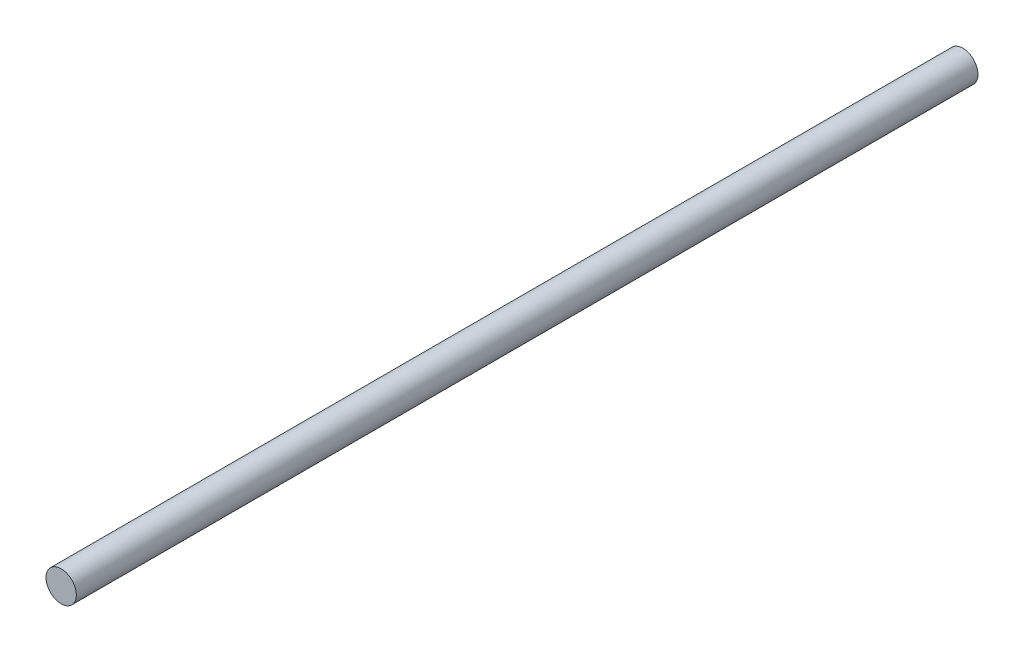
ISO-10303-21;
HEADER;
FILE_DESCRIPTION(('STEP AP214'),'2;1');
FILE_NAME('part.step','',(''),(''),'','','');
FILE_SCHEMA(('AUTOMOTIVE_DESIGN { 1 0 10303 214 1 1 1 1 }'));
ENDSEC;
DATA;
#1=APPLICATION_CONTEXT('core data for automotive mechanical design processes');
#2=APPLICATION_PROTOCOL_DEFINITION('international standard','automotive_design',2000,#1);
#3=PRODUCT_CONTEXT('',#1,'mechanical');
#4=PRODUCT('Part','Part','',(#3));
#5=PRODUCT_RELATED_PRODUCT_CATEGORY('part','',(#4));
#6=PRODUCT_DEFINITION_FORMATION('','',#4);
#7=PRODUCT_DEFINITION_CONTEXT('part definition',#1,'design');
#8=PRODUCT_DEFINITION('design','',#6,#7);
#9=PRODUCT_DEFINITION_SHAPE('','',#8);
#10=(LENGTH_UNIT() NAMED_UNIT(*) SI_UNIT(.MILLI.,.METRE.));
#11=(NAMED_UNIT(*) PLANE_ANGLE_UNIT() SI_UNIT($,.RADIAN.));
#12=(NAMED_UNIT(*) SI_UNIT($,.STERADIAN.) SOLID_ANGLE_UNIT());
#13=UNCERTAINTY_MEASURE_WITH_UNIT(LENGTH_MEASURE(1.E-05),#10,'distance_accuracy_value','');
#14=(GEOMETRIC_REPRESENTATION_CONTEXT(3) GLOBAL_UNCERTAINTY_ASSIGNED_CONTEXT((#13)) GLOBAL_UNIT_ASSIGNED_CONTEXT((#10,
#11,#12)) REPRESENTATION_CONTEXT('',''));
#15=CARTESIAN_POINT('',(0.,0.,0.));
#16=DIRECTION('',(0.,0.,1.));
#17=DIRECTION('',(1.,0.,0.));
#18=AXIS2_PLACEMENT_3D('',#15,#16,#17);
#19=CARTESIAN_POINT('',(0.,0.,148.5));
#20=DIRECTION('',(0.,0.,-1.));
#21=DIRECTION('',(-1.,0.,0.));
#22=AXIS2_PLACEMENT_3D('',#19,#20,#21);
#23=CYLINDRICAL_SURFACE('',#22,2.5);
#24=CARTESIAN_POINT('',(0.,0.,148.5));
#25=DIRECTION('',(0.,0.,1.));
#26=DIRECTION('',(1.,0.,0.));
#27=AXIS2_PLACEMENT_3D('',#24,#25,#26);
#28=CIRCLE('',#27,2.5);
#29=CARTESIAN_POINT('',(2.5,0.,148.5));
#30=VERTEX_POINT('',#29);
#31=EDGE_CURVE('E10',#30,#30,#28,.T.);
#32=ORIENTED_EDGE('',*,*,#31,.F.);
#33=EDGE_LOOP('',(#32));
#34=FACE_BOUND('',#33,.T.);
#35=CARTESIAN_POINT('',(0.,0.,0.));
#36=DIRECTION('',(0.,0.,1.));
#37=DIRECTION('',(1.,0.,0.));
#38=AXIS2_PLACEMENT_3D('',#35,#36,#37);
#39=CIRCLE('',#38,2.5);
#40=CARTESIAN_POINT('',(2.5,0.,0.));
#41=VERTEX_POINT('',#40);
#42=EDGE_CURVE('E34',#41,#41,#39,.T.);
#43=ORIENTED_EDGE('',*,*,#42,.T.);
#44=EDGE_LOOP('',(#43));
#45=FACE_BOUND('',#44,.T.);
#46=ADVANCED_FACE('F31',(#34,#45),#23,.T.);
#47=CARTESIAN_POINT('',(0.,0.,148.5));
#48=DIRECTION('',(0.,0.,1.));
#49=DIRECTION('',(1.,0.,0.));
#50=AXIS2_PLACEMENT_3D('',#47,#48,#49);
#51=PLANE('',#50);
#52=ORIENTED_EDGE('',*,*,#31,.T.);
#53=EDGE_LOOP('',(#52));
#54=FACE_BOUND('',#53,.T.);
#55=ADVANCED_FACE('F46',(#54),#51,.T.);
#56=CARTESIAN_POINT('',(0.,0.,0.));
#57=DIRECTION('',(0.,0.,1.));
#58=DIRECTION('',(1.,0.,0.));
#59=AXIS2_PLACEMENT_3D('',#56,#57,#58);
#60=PLANE('',#59);
#61=ORIENTED_EDGE('',*,*,#42,.F.);
#62=EDGE_LOOP('',(#61));
#63=FACE_BOUND('',#62,.T.);
#64=ADVANCED_FACE('F44',(#63),#60,.F.);
#65=CLOSED_SHELL('',(#46,#55,#64));
#66=MANIFOLD_SOLID_BREP('B2',#65);
#67=ADVANCED_BREP_SHAPE_REPRESENTATION('',(#18,#66),#14);
#68=SHAPE_DEFINITION_REPRESENTATION(#9,#67);
ENDSEC;
END-ISO-10303-21;
